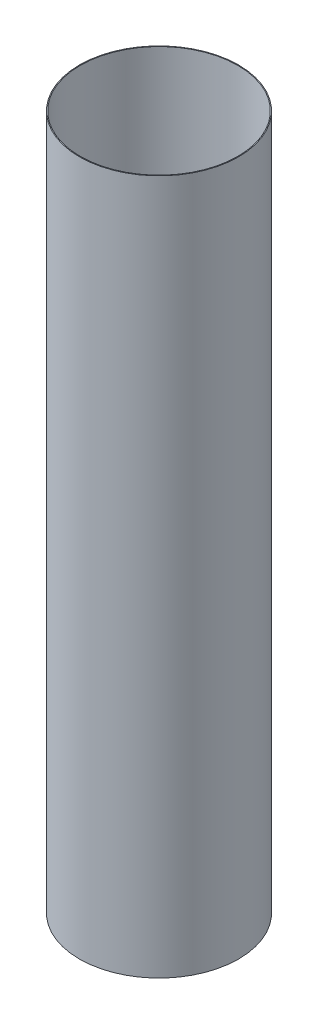
ISO-10303-21;
HEADER;
FILE_DESCRIPTION(('STEP AP214'),'2;1');
FILE_NAME('part.step','',(''),(''),'','','');
FILE_SCHEMA(('AUTOMOTIVE_DESIGN { 1 0 10303 214 1 1 1 1 }'));
ENDSEC;
DATA;
#1=APPLICATION_CONTEXT('core data for automotive mechanical design processes');
#2=APPLICATION_PROTOCOL_DEFINITION('international standard','automotive_design',2000,#1);
#3=PRODUCT_CONTEXT('',#1,'mechanical');
#4=PRODUCT('Part','Part','',(#3));
#5=PRODUCT_RELATED_PRODUCT_CATEGORY('part','',(#4));
#6=PRODUCT_DEFINITION_FORMATION('','',#4);
#7=PRODUCT_DEFINITION_CONTEXT('part definition',#1,'design');
#8=PRODUCT_DEFINITION('design','',#6,#7);
#9=PRODUCT_DEFINITION_SHAPE('','',#8);
#10=(LENGTH_UNIT() NAMED_UNIT(*) SI_UNIT(.MILLI.,.METRE.));
#11=(NAMED_UNIT(*) PLANE_ANGLE_UNIT() SI_UNIT($,.RADIAN.));
#12=(NAMED_UNIT(*) SI_UNIT($,.STERADIAN.) SOLID_ANGLE_UNIT());
#13=UNCERTAINTY_MEASURE_WITH_UNIT(LENGTH_MEASURE(1.E-05),#10,'distance_accuracy_value','');
#14=(GEOMETRIC_REPRESENTATION_CONTEXT(3) GLOBAL_UNCERTAINTY_ASSIGNED_CONTEXT((#13)) GLOBAL_UNIT_ASSIGNED_CONTEXT((#10,
#11,#12)) REPRESENTATION_CONTEXT('',''));
#15=CARTESIAN_POINT('',(0.,0.,0.));
#16=DIRECTION('',(0.,0.,1.));
#17=DIRECTION('',(1.,0.,0.));
#18=AXIS2_PLACEMENT_3D('',#15,#16,#17);
#19=CARTESIAN_POINT('',(0.,332.6,0.));
#20=DIRECTION('',(0.,1.,0.));
#21=DIRECTION('',(0.,0.,1.));
#22=AXIS2_PLACEMENT_3D('',#19,#20,#21);
#23=PLANE('',#22);
#24=CARTESIAN_POINT('',(0.,332.6,0.));
#25=DIRECTION('',(0.,1.,0.));
#26=DIRECTION('',(0.,0.,1.));
#27=AXIS2_PLACEMENT_3D('',#24,#25,#26);
#28=CIRCLE('',#27,38.1);
#29=CARTESIAN_POINT('',(0.,332.6,38.1));
#30=VERTEX_POINT('',#29);
#31=EDGE_CURVE('E10',#30,#30,#28,.T.);
#32=ORIENTED_EDGE('',*,*,#31,.T.);
#33=EDGE_LOOP('',(#32));
#34=FACE_BOUND('',#33,.T.);
#35=CARTESIAN_POINT('',(0.,332.6,0.));
#36=DIRECTION('',(0.,1.,0.));
#37=DIRECTION('',(0.,0.,1.));
#38=AXIS2_PLACEMENT_3D('',#35,#36,#37);
#39=CIRCLE('',#38,37.72154);
#40=CARTESIAN_POINT('',(0.,332.6,37.72154));
#41=VERTEX_POINT('',#40);
#42=EDGE_CURVE('E41',#41,#41,#39,.T.);
#43=ORIENTED_EDGE('',*,*,#42,.F.);
#44=EDGE_LOOP('',(#43));
#45=FACE_BOUND('',#44,.T.);
#46=ADVANCED_FACE('F30',(#34,#45),#23,.T.);
#47=CARTESIAN_POINT('',(0.,0.,0.));
#48=DIRECTION('',(0.,1.,0.));
#49=DIRECTION('',(0.,0.,1.));
#50=AXIS2_PLACEMENT_3D('',#47,#48,#49);
#51=PLANE('',#50);
#52=CARTESIAN_POINT('',(0.,0.,0.));
#53=DIRECTION('',(0.,1.,0.));
#54=DIRECTION('',(0.,0.,1.));
#55=AXIS2_PLACEMENT_3D('',#52,#53,#54);
#56=CIRCLE('',#55,38.1);
#57=CARTESIAN_POINT('',(0.,0.,38.1));
#58=VERTEX_POINT('',#57);
#59=EDGE_CURVE('E34',#58,#58,#56,.T.);
#60=ORIENTED_EDGE('',*,*,#59,.F.);
#61=EDGE_LOOP('',(#60));
#62=FACE_BOUND('',#61,.T.);
#63=CARTESIAN_POINT('',(0.,0.,0.));
#64=DIRECTION('',(0.,1.,0.));
#65=DIRECTION('',(0.,0.,1.));
#66=AXIS2_PLACEMENT_3D('',#63,#64,#65);
#67=CIRCLE('',#66,37.72154);
#68=CARTESIAN_POINT('',(0.,0.,37.72154));
#69=VERTEX_POINT('',#68);
#70=EDGE_CURVE('E43',#69,#69,#67,.T.);
#71=ORIENTED_EDGE('',*,*,#70,.T.);
#72=EDGE_LOOP('',(#71));
#73=FACE_BOUND('',#72,.T.);
#74=ADVANCED_FACE('F53',(#62,#73),#51,.F.);
#75=CARTESIAN_POINT('',(0.,332.6,0.));
#76=DIRECTION('',(0.,-1.,0.));
#77=DIRECTION('',(0.,0.,-1.));
#78=AXIS2_PLACEMENT_3D('',#75,#76,#77);
#79=CYLINDRICAL_SURFACE('',#78,38.1);
#80=ORIENTED_EDGE('',*,*,#31,.F.);
#81=EDGE_LOOP('',(#80));
#82=FACE_BOUND('',#81,.T.);
#83=ORIENTED_EDGE('',*,*,#59,.T.);
#84=EDGE_LOOP('',(#83));
#85=FACE_BOUND('',#84,.T.);
#86=ADVANCED_FACE('F32',(#82,#85),#79,.T.);
#87=CARTESIAN_POINT('',(0.,332.6,0.));
#88=DIRECTION('',(0.,-1.,0.));
#89=DIRECTION('',(0.,0.,-1.));
#90=AXIS2_PLACEMENT_3D('',#87,#88,#89);
#91=CYLINDRICAL_SURFACE('',#90,37.72154);
#92=ORIENTED_EDGE('',*,*,#42,.T.);
#93=EDGE_LOOP('',(#92));
#94=FACE_BOUND('',#93,.T.);
#95=ORIENTED_EDGE('',*,*,#70,.F.);
#96=EDGE_LOOP('',(#95));
#97=FACE_BOUND('',#96,.T.);
#98=ADVANCED_FACE('F49',(#94,#97),#91,.F.);
#99=CLOSED_SHELL('',(#46,#74,#86,#98));
#100=MANIFOLD_SOLID_BREP('B2',#99);
#101=ADVANCED_BREP_SHAPE_REPRESENTATION('',(#18,#100),#14);
#102=SHAPE_DEFINITION_REPRESENTATION(#9,#101);
ENDSEC;
END-ISO-10303-21;
